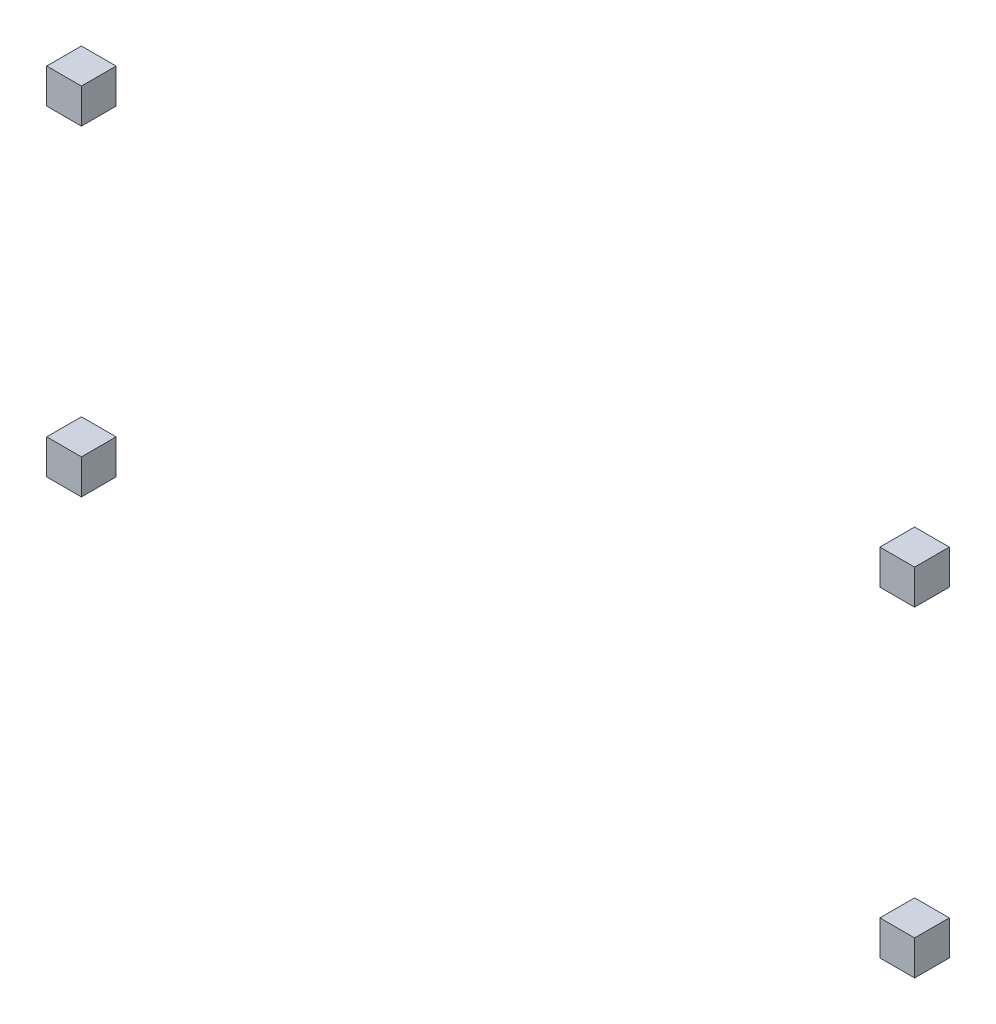
ISO-10303-21;
HEADER;
FILE_DESCRIPTION(('STEP AP214'),'2;1');
FILE_NAME('part.step','',(''),(''),'','','');
FILE_SCHEMA(('AUTOMOTIVE_DESIGN { 1 0 10303 214 1 1 1 1 }'));
ENDSEC;
DATA;
#1=APPLICATION_CONTEXT('core data for automotive mechanical design processes');
#2=APPLICATION_PROTOCOL_DEFINITION('international standard','automotive_design',2000,#1);
#3=PRODUCT_CONTEXT('',#1,'mechanical');
#4=PRODUCT('Part','Part','',(#3));
#5=PRODUCT_RELATED_PRODUCT_CATEGORY('part','',(#4));
#6=PRODUCT_DEFINITION_FORMATION('','',#4);
#7=PRODUCT_DEFINITION_CONTEXT('part definition',#1,'design');
#8=PRODUCT_DEFINITION('design','',#6,#7);
#9=PRODUCT_DEFINITION_SHAPE('','',#8);
#10=(LENGTH_UNIT() NAMED_UNIT(*) SI_UNIT(.MILLI.,.METRE.));
#11=(NAMED_UNIT(*) PLANE_ANGLE_UNIT() SI_UNIT($,.RADIAN.));
#12=(NAMED_UNIT(*) SI_UNIT($,.STERADIAN.) SOLID_ANGLE_UNIT());
#13=UNCERTAINTY_MEASURE_WITH_UNIT(LENGTH_MEASURE(1.E-05),#10,'distance_accuracy_value','');
#14=(GEOMETRIC_REPRESENTATION_CONTEXT(3) GLOBAL_UNCERTAINTY_ASSIGNED_CONTEXT((#13)) GLOBAL_UNIT_ASSIGNED_CONTEXT((#10,
#11,#12)) REPRESENTATION_CONTEXT('',''));
#15=CARTESIAN_POINT('',(0.,0.,0.));
#16=DIRECTION('',(0.,0.,1.));
#17=DIRECTION('',(1.,0.,0.));
#18=AXIS2_PLACEMENT_3D('',#15,#16,#17);
#19=CARTESIAN_POINT('',(-500.,165.,-45.));
#20=DIRECTION('',(0.,0.,1.));
#21=DIRECTION('',(1.,0.,0.));
#22=AXIS2_PLACEMENT_3D('',#19,#20,#21);
#23=PLANE('',#22);
#24=DIRECTION('',(0.,1.,0.));
#25=VECTOR('',#24,1.);
#26=CARTESIAN_POINT('',(-500.,165.,-45.));
#27=LINE('',#26,#25);
#28=CARTESIAN_POINT('',(-500.,165.,-45.));
#29=VERTEX_POINT('',#28);
#30=CARTESIAN_POINT('',(-500.,205.,-45.));
#31=VERTEX_POINT('',#30);
#32=EDGE_CURVE('P0_E99',#29,#31,#27,.T.);
#33=ORIENTED_EDGE('',*,*,#32,.F.);
#34=DIRECTION('',(1.,0.,0.));
#35=VECTOR('',#34,1.);
#36=CARTESIAN_POINT('',(-500.,165.,-45.));
#37=LINE('',#36,#35);
#38=CARTESIAN_POINT('',(-460.,165.,-45.));
#39=VERTEX_POINT('',#38);
#40=EDGE_CURVE('P0_E77',#29,#39,#37,.T.);
#41=ORIENTED_EDGE('',*,*,#40,.T.);
#42=DIRECTION('',(0.,1.,0.));
#43=VECTOR('',#42,1.);
#44=CARTESIAN_POINT('',(-460.,165.,-45.));
#45=LINE('',#44,#43);
#46=CARTESIAN_POINT('',(-460.,205.,-45.));
#47=VERTEX_POINT('',#46);
#48=EDGE_CURVE('P0_E90',#39,#47,#45,.T.);
#49=ORIENTED_EDGE('',*,*,#48,.T.);
#50=DIRECTION('',(1.,0.,0.));
#51=VECTOR('',#50,1.);
#52=CARTESIAN_POINT('',(-500.,205.,-45.));
#53=LINE('',#52,#51);
#54=EDGE_CURVE('P0_E11',#31,#47,#53,.T.);
#55=ORIENTED_EDGE('',*,*,#54,.F.);
#56=EDGE_LOOP('',(#33,#41,#49,#55));
#57=FACE_BOUND('',#56,.T.);
#58=ADVANCED_FACE('P0_F17',(#57),#23,.T.);
#59=CARTESIAN_POINT('',(-500.,165.,-85.));
#60=DIRECTION('',(0.,0.,1.));
#61=DIRECTION('',(1.,0.,0.));
#62=AXIS2_PLACEMENT_3D('',#59,#60,#61);
#63=PLANE('',#62);
#64=DIRECTION('',(1.,0.,0.));
#65=VECTOR('',#64,1.);
#66=CARTESIAN_POINT('',(-500.,205.,-85.));
#67=LINE('',#66,#65);
#68=CARTESIAN_POINT('',(-500.,205.,-85.));
#69=VERTEX_POINT('',#68);
#70=CARTESIAN_POINT('',(-460.,205.,-85.));
#71=VERTEX_POINT('',#70);
#72=EDGE_CURVE('P0_E27',#69,#71,#67,.T.);
#73=ORIENTED_EDGE('',*,*,#72,.T.);
#74=DIRECTION('',(0.,1.,0.));
#75=VECTOR('',#74,1.);
#76=CARTESIAN_POINT('',(-460.,165.,-85.));
#77=LINE('',#76,#75);
#78=CARTESIAN_POINT('',(-460.,165.,-85.));
#79=VERTEX_POINT('',#78);
#80=EDGE_CURVE('P0_E81',#79,#71,#77,.T.);
#81=ORIENTED_EDGE('',*,*,#80,.F.);
#82=DIRECTION('',(1.,0.,0.));
#83=VECTOR('',#82,1.);
#84=CARTESIAN_POINT('',(-500.,165.,-85.));
#85=LINE('',#84,#83);
#86=CARTESIAN_POINT('',(-500.,165.,-85.));
#87=VERTEX_POINT('',#86);
#88=EDGE_CURVE('P0_E67',#87,#79,#85,.T.);
#89=ORIENTED_EDGE('',*,*,#88,.F.);
#90=DIRECTION('',(0.,1.,0.));
#91=VECTOR('',#90,1.);
#92=CARTESIAN_POINT('',(-500.,165.,-85.));
#93=LINE('',#92,#91);
#94=EDGE_CURVE('P0_E96',#87,#69,#93,.T.);
#95=ORIENTED_EDGE('',*,*,#94,.T.);
#96=EDGE_LOOP('',(#73,#81,#89,#95));
#97=FACE_BOUND('',#96,.T.);
#98=ADVANCED_FACE('P0_F19',(#97),#63,.F.);
#99=CARTESIAN_POINT('',(-500.,205.,-85.));
#100=DIRECTION('',(0.,1.,0.));
#101=DIRECTION('',(1.,0.,0.));
#102=AXIS2_PLACEMENT_3D('',#99,#100,#101);
#103=PLANE('',#102);
#104=ORIENTED_EDGE('',*,*,#72,.F.);
#105=DIRECTION('',(0.,0.,1.));
#106=VECTOR('',#105,1.);
#107=CARTESIAN_POINT('',(-500.,205.,-85.));
#108=LINE('',#107,#106);
#109=EDGE_CURVE('P0_E103',#69,#31,#108,.T.);
#110=ORIENTED_EDGE('',*,*,#109,.T.);
#111=ORIENTED_EDGE('',*,*,#54,.T.);
#112=DIRECTION('',(0.,0.,1.));
#113=VECTOR('',#112,1.);
#114=CARTESIAN_POINT('',(-460.,205.,-85.));
#115=LINE('',#114,#113);
#116=EDGE_CURVE('P0_E84',#71,#47,#115,.T.);
#117=ORIENTED_EDGE('',*,*,#116,.F.);
#118=EDGE_LOOP('',(#104,#110,#111,#117));
#119=FACE_BOUND('',#118,.T.);
#120=ADVANCED_FACE('P0_F146',(#119),#103,.T.);
#121=CARTESIAN_POINT('',(-500.,165.,-85.));
#122=DIRECTION('',(0.,1.,0.));
#123=DIRECTION('',(1.,0.,0.));
#124=AXIS2_PLACEMENT_3D('',#121,#122,#123);
#125=PLANE('',#124);
#126=DIRECTION('',(0.,0.,1.));
#127=VECTOR('',#126,1.);
#128=CARTESIAN_POINT('',(-460.,165.,-85.));
#129=LINE('',#128,#127);
#130=EDGE_CURVE('P0_E73',#79,#39,#129,.T.);
#131=ORIENTED_EDGE('',*,*,#130,.T.);
#132=ORIENTED_EDGE('',*,*,#40,.F.);
#133=DIRECTION('',(0.,0.,1.));
#134=VECTOR('',#133,1.);
#135=CARTESIAN_POINT('',(-500.,165.,-85.));
#136=LINE('',#135,#134);
#137=EDGE_CURVE('P0_E74',#87,#29,#136,.T.);
#138=ORIENTED_EDGE('',*,*,#137,.F.);
#139=ORIENTED_EDGE('',*,*,#88,.T.);
#140=EDGE_LOOP('',(#131,#132,#138,#139));
#141=FACE_BOUND('',#140,.T.);
#142=ADVANCED_FACE('P0_F69',(#141),#125,.F.);
#143=CARTESIAN_POINT('',(-460.,165.,-85.));
#144=DIRECTION('',(1.,0.,0.));
#145=DIRECTION('',(0.,1.,0.));
#146=AXIS2_PLACEMENT_3D('',#143,#144,#145);
#147=PLANE('',#146);
#148=ORIENTED_EDGE('',*,*,#130,.F.);
#149=ORIENTED_EDGE('',*,*,#80,.T.);
#150=ORIENTED_EDGE('',*,*,#116,.T.);
#151=ORIENTED_EDGE('',*,*,#48,.F.);
#152=EDGE_LOOP('',(#148,#149,#150,#151));
#153=FACE_BOUND('',#152,.T.);
#154=ADVANCED_FACE('P0_F86',(#153),#147,.T.);
#155=CARTESIAN_POINT('',(-500.,165.,-85.));
#156=DIRECTION('',(1.,0.,0.));
#157=DIRECTION('',(0.,1.,0.));
#158=AXIS2_PLACEMENT_3D('',#155,#156,#157);
#159=PLANE('',#158);
#160=ORIENTED_EDGE('',*,*,#32,.T.);
#161=ORIENTED_EDGE('',*,*,#109,.F.);
#162=ORIENTED_EDGE('',*,*,#94,.F.);
#163=ORIENTED_EDGE('',*,*,#137,.T.);
#164=EDGE_LOOP('',(#160,#161,#162,#163));
#165=FACE_BOUND('',#164,.T.);
#166=ADVANCED_FACE('P0_F128',(#165),#159,.F.);
#167=CLOSED_SHELL('',(#58,#98,#120,#142,#154,#166));
#168=MANIFOLD_SOLID_BREP('P0_B1',#167);
#169=CARTESIAN_POINT('',(460.,-205.,-45.));
#170=DIRECTION('',(0.,0.,1.));
#171=DIRECTION('',(1.,0.,0.));
#172=AXIS2_PLACEMENT_3D('',#169,#170,#171);
#173=PLANE('',#172);
#174=DIRECTION('',(0.,1.,0.));
#175=VECTOR('',#174,1.);
#176=CARTESIAN_POINT('',(460.,-205.,-45.));
#177=LINE('',#176,#175);
#178=CARTESIAN_POINT('',(460.,-205.,-45.));
#179=VERTEX_POINT('',#178);
#180=CARTESIAN_POINT('',(460.,-165.,-45.));
#181=VERTEX_POINT('',#180);
#182=EDGE_CURVE('P1_E163',#179,#181,#177,.T.);
#183=ORIENTED_EDGE('',*,*,#182,.F.);
#184=DIRECTION('',(1.,0.,0.));
#185=VECTOR('',#184,1.);
#186=CARTESIAN_POINT('',(460.,-205.,-45.));
#187=LINE('',#186,#185);
#188=CARTESIAN_POINT('',(500.,-205.,-45.));
#189=VERTEX_POINT('',#188);
#190=EDGE_CURVE('P1_E77',#179,#189,#187,.T.);
#191=ORIENTED_EDGE('',*,*,#190,.T.);
#192=DIRECTION('',(0.,1.,0.));
#193=VECTOR('',#192,1.);
#194=CARTESIAN_POINT('',(500.,-205.,-45.));
#195=LINE('',#194,#193);
#196=CARTESIAN_POINT('',(500.,-165.,-45.));
#197=VERTEX_POINT('',#196);
#198=EDGE_CURVE('P1_E89',#189,#197,#195,.T.);
#199=ORIENTED_EDGE('',*,*,#198,.T.);
#200=DIRECTION('',(1.,0.,0.));
#201=VECTOR('',#200,1.);
#202=CARTESIAN_POINT('',(460.,-165.,-45.));
#203=LINE('',#202,#201);
#204=EDGE_CURVE('P1_E11',#181,#197,#203,.T.);
#205=ORIENTED_EDGE('',*,*,#204,.F.);
#206=EDGE_LOOP('',(#183,#191,#199,#205));
#207=FACE_BOUND('',#206,.T.);
#208=ADVANCED_FACE('P1_F17',(#207),#173,.T.);
#209=CARTESIAN_POINT('',(460.,-205.,-85.));
#210=DIRECTION('',(0.,0.,1.));
#211=DIRECTION('',(1.,0.,0.));
#212=AXIS2_PLACEMENT_3D('',#209,#210,#211);
#213=PLANE('',#212);
#214=DIRECTION('',(1.,0.,0.));
#215=VECTOR('',#214,1.);
#216=CARTESIAN_POINT('',(460.,-165.,-85.));
#217=LINE('',#216,#215);
#218=CARTESIAN_POINT('',(460.,-165.,-85.));
#219=VERTEX_POINT('',#218);
#220=CARTESIAN_POINT('',(500.,-165.,-85.));
#221=VERTEX_POINT('',#220);
#222=EDGE_CURVE('P1_E25',#219,#221,#217,.T.);
#223=ORIENTED_EDGE('',*,*,#222,.T.);
#224=DIRECTION('',(0.,1.,0.));
#225=VECTOR('',#224,1.);
#226=CARTESIAN_POINT('',(500.,-205.,-85.));
#227=LINE('',#226,#225);
#228=CARTESIAN_POINT('',(500.,-205.,-85.));
#229=VERTEX_POINT('',#228);
#230=EDGE_CURVE('P1_E81',#229,#221,#227,.T.);
#231=ORIENTED_EDGE('',*,*,#230,.F.);
#232=DIRECTION('',(1.,0.,0.));
#233=VECTOR('',#232,1.);
#234=CARTESIAN_POINT('',(460.,-205.,-85.));
#235=LINE('',#234,#233);
#236=CARTESIAN_POINT('',(460.,-205.,-85.));
#237=VERTEX_POINT('',#236);
#238=EDGE_CURVE('P1_E69',#237,#229,#235,.T.);
#239=ORIENTED_EDGE('',*,*,#238,.F.);
#240=DIRECTION('',(0.,1.,0.));
#241=VECTOR('',#240,1.);
#242=CARTESIAN_POINT('',(460.,-205.,-85.));
#243=LINE('',#242,#241);
#244=EDGE_CURVE('P1_E96',#237,#219,#243,.T.);
#245=ORIENTED_EDGE('',*,*,#244,.T.);
#246=EDGE_LOOP('',(#223,#231,#239,#245));
#247=FACE_BOUND('',#246,.T.);
#248=ADVANCED_FACE('P1_F85',(#247),#213,.F.);
#249=CARTESIAN_POINT('',(460.,-165.,-85.));
#250=DIRECTION('',(0.,1.,0.));
#251=DIRECTION('',(1.,0.,0.));
#252=AXIS2_PLACEMENT_3D('',#249,#250,#251);
#253=PLANE('',#252);
#254=ORIENTED_EDGE('',*,*,#222,.F.);
#255=DIRECTION('',(0.,0.,1.));
#256=VECTOR('',#255,1.);
#257=CARTESIAN_POINT('',(460.,-165.,-85.));
#258=LINE('',#257,#256);
#259=EDGE_CURVE('P1_E170',#219,#181,#258,.T.);
#260=ORIENTED_EDGE('',*,*,#259,.T.);
#261=ORIENTED_EDGE('',*,*,#204,.T.);
#262=DIRECTION('',(0.,0.,1.));
#263=VECTOR('',#262,1.);
#264=CARTESIAN_POINT('',(500.,-165.,-85.));
#265=LINE('',#264,#263);
#266=EDGE_CURVE('P1_E88',#221,#197,#265,.T.);
#267=ORIENTED_EDGE('',*,*,#266,.F.);
#268=EDGE_LOOP('',(#254,#260,#261,#267));
#269=FACE_BOUND('',#268,.T.);
#270=ADVANCED_FACE('P1_F127',(#269),#253,.T.);
#271=CARTESIAN_POINT('',(460.,-205.,-85.));
#272=DIRECTION('',(0.,1.,0.));
#273=DIRECTION('',(1.,0.,0.));
#274=AXIS2_PLACEMENT_3D('',#271,#272,#273);
#275=PLANE('',#274);
#276=DIRECTION('',(0.,0.,1.));
#277=VECTOR('',#276,1.);
#278=CARTESIAN_POINT('',(500.,-205.,-85.));
#279=LINE('',#278,#277);
#280=EDGE_CURVE('P1_E73',#229,#189,#279,.T.);
#281=ORIENTED_EDGE('',*,*,#280,.T.);
#282=ORIENTED_EDGE('',*,*,#190,.F.);
#283=DIRECTION('',(0.,0.,1.));
#284=VECTOR('',#283,1.);
#285=CARTESIAN_POINT('',(460.,-205.,-85.));
#286=LINE('',#285,#284);
#287=EDGE_CURVE('P1_E74',#237,#179,#286,.T.);
#288=ORIENTED_EDGE('',*,*,#287,.F.);
#289=ORIENTED_EDGE('',*,*,#238,.T.);
#290=EDGE_LOOP('',(#281,#282,#288,#289));
#291=FACE_BOUND('',#290,.T.);
#292=ADVANCED_FACE('P1_F75',(#291),#275,.F.);
#293=CARTESIAN_POINT('',(500.,-205.,-85.));
#294=DIRECTION('',(1.,0.,0.));
#295=DIRECTION('',(0.,1.,0.));
#296=AXIS2_PLACEMENT_3D('',#293,#294,#295);
#297=PLANE('',#296);
#298=ORIENTED_EDGE('',*,*,#280,.F.);
#299=ORIENTED_EDGE('',*,*,#230,.T.);
#300=ORIENTED_EDGE('',*,*,#266,.T.);
#301=ORIENTED_EDGE('',*,*,#198,.F.);
#302=EDGE_LOOP('',(#298,#299,#300,#301));
#303=FACE_BOUND('',#302,.T.);
#304=ADVANCED_FACE('P1_F90',(#303),#297,.T.);
#305=CARTESIAN_POINT('',(460.,-205.,-85.));
#306=DIRECTION('',(1.,0.,0.));
#307=DIRECTION('',(0.,1.,0.));
#308=AXIS2_PLACEMENT_3D('',#305,#306,#307);
#309=PLANE('',#308);
#310=ORIENTED_EDGE('',*,*,#182,.T.);
#311=ORIENTED_EDGE('',*,*,#259,.F.);
#312=ORIENTED_EDGE('',*,*,#244,.F.);
#313=ORIENTED_EDGE('',*,*,#287,.T.);
#314=EDGE_LOOP('',(#310,#311,#312,#313));
#315=FACE_BOUND('',#314,.T.);
#316=ADVANCED_FACE('P1_F107',(#315),#309,.F.);
#317=CLOSED_SHELL('',(#208,#248,#270,#292,#304,#316));
#318=MANIFOLD_SOLID_BREP('P1_B1',#317);
#319=CARTESIAN_POINT('',(-500.,-205.,-45.));
#320=DIRECTION('',(0.,0.,1.));
#321=DIRECTION('',(1.,0.,0.));
#322=AXIS2_PLACEMENT_3D('',#319,#320,#321);
#323=PLANE('',#322);
#324=DIRECTION('',(0.,1.,0.));
#325=VECTOR('',#324,1.);
#326=CARTESIAN_POINT('',(-500.,-205.,-45.));
#327=LINE('',#326,#325);
#328=CARTESIAN_POINT('',(-500.,-205.,-45.));
#329=VERTEX_POINT('',#328);
#330=CARTESIAN_POINT('',(-500.,-165.,-45.));
#331=VERTEX_POINT('',#330);
#332=EDGE_CURVE('P2_E86',#329,#331,#327,.T.);
#333=ORIENTED_EDGE('',*,*,#332,.F.);
#334=DIRECTION('',(1.,0.,0.));
#335=VECTOR('',#334,1.);
#336=CARTESIAN_POINT('',(-500.,-205.,-45.));
#337=LINE('',#336,#335);
#338=CARTESIAN_POINT('',(-460.,-205.,-45.));
#339=VERTEX_POINT('',#338);
#340=EDGE_CURVE('P2_E69',#329,#339,#337,.T.);
#341=ORIENTED_EDGE('',*,*,#340,.T.);
#342=DIRECTION('',(0.,1.,0.));
#343=VECTOR('',#342,1.);
#344=CARTESIAN_POINT('',(-460.,-205.,-45.));
#345=LINE('',#344,#343);
#346=CARTESIAN_POINT('',(-460.,-165.,-45.));
#347=VERTEX_POINT('',#346);
#348=EDGE_CURVE('P2_E85',#339,#347,#345,.T.);
#349=ORIENTED_EDGE('',*,*,#348,.T.);
#350=DIRECTION('',(1.,0.,0.));
#351=VECTOR('',#350,1.);
#352=CARTESIAN_POINT('',(-500.,-165.,-45.));
#353=LINE('',#352,#351);
#354=EDGE_CURVE('P2_E11',#331,#347,#353,.T.);
#355=ORIENTED_EDGE('',*,*,#354,.F.);
#356=EDGE_LOOP('',(#333,#341,#349,#355));
#357=FACE_BOUND('',#356,.T.);
#358=ADVANCED_FACE('P2_F17',(#357),#323,.T.);
#359=CARTESIAN_POINT('',(-500.,-205.,-85.));
#360=DIRECTION('',(0.,0.,1.));
#361=DIRECTION('',(1.,0.,0.));
#362=AXIS2_PLACEMENT_3D('',#359,#360,#361);
#363=PLANE('',#362);
#364=DIRECTION('',(1.,0.,0.));
#365=VECTOR('',#364,1.);
#366=CARTESIAN_POINT('',(-500.,-165.,-85.));
#367=LINE('',#366,#365);
#368=CARTESIAN_POINT('',(-500.,-165.,-85.));
#369=VERTEX_POINT('',#368);
#370=CARTESIAN_POINT('',(-460.,-165.,-85.));
#371=VERTEX_POINT('',#370);
#372=EDGE_CURVE('P2_E20',#369,#371,#367,.T.);
#373=ORIENTED_EDGE('',*,*,#372,.T.);
#374=DIRECTION('',(0.,1.,0.));
#375=VECTOR('',#374,1.);
#376=CARTESIAN_POINT('',(-460.,-205.,-85.));
#377=LINE('',#376,#375);
#378=CARTESIAN_POINT('',(-460.,-205.,-85.));
#379=VERTEX_POINT('',#378);
#380=EDGE_CURVE('P2_E99',#379,#371,#377,.T.);
#381=ORIENTED_EDGE('',*,*,#380,.F.);
#382=DIRECTION('',(1.,0.,0.));
#383=VECTOR('',#382,1.);
#384=CARTESIAN_POINT('',(-500.,-205.,-85.));
#385=LINE('',#384,#383);
#386=CARTESIAN_POINT('',(-500.,-205.,-85.));
#387=VERTEX_POINT('',#386);
#388=EDGE_CURVE('P2_E81',#387,#379,#385,.T.);
#389=ORIENTED_EDGE('',*,*,#388,.F.);
#390=DIRECTION('',(0.,1.,0.));
#391=VECTOR('',#390,1.);
#392=CARTESIAN_POINT('',(-500.,-205.,-85.));
#393=LINE('',#392,#391);
#394=EDGE_CURVE('P2_E90',#387,#369,#393,.T.);
#395=ORIENTED_EDGE('',*,*,#394,.T.);
#396=EDGE_LOOP('',(#373,#381,#389,#395));
#397=FACE_BOUND('',#396,.T.);
#398=ADVANCED_FACE('P2_F149',(#397),#363,.F.);
#399=CARTESIAN_POINT('',(-500.,-165.,-85.));
#400=DIRECTION('',(0.,1.,0.));
#401=DIRECTION('',(1.,0.,0.));
#402=AXIS2_PLACEMENT_3D('',#399,#400,#401);
#403=PLANE('',#402);
#404=ORIENTED_EDGE('',*,*,#372,.F.);
#405=DIRECTION('',(0.,0.,1.));
#406=VECTOR('',#405,1.);
#407=CARTESIAN_POINT('',(-500.,-165.,-85.));
#408=LINE('',#407,#406);
#409=EDGE_CURVE('P2_E91',#369,#331,#408,.T.);
#410=ORIENTED_EDGE('',*,*,#409,.T.);
#411=ORIENTED_EDGE('',*,*,#354,.T.);
#412=DIRECTION('',(0.,0.,1.));
#413=VECTOR('',#412,1.);
#414=CARTESIAN_POINT('',(-460.,-165.,-85.));
#415=LINE('',#414,#413);
#416=EDGE_CURVE('P2_E106',#371,#347,#415,.T.);
#417=ORIENTED_EDGE('',*,*,#416,.F.);
#418=EDGE_LOOP('',(#404,#410,#411,#417));
#419=FACE_BOUND('',#418,.T.);
#420=ADVANCED_FACE('P2_F143',(#419),#403,.T.);
#421=CARTESIAN_POINT('',(-500.,-205.,-85.));
#422=DIRECTION('',(0.,1.,0.));
#423=DIRECTION('',(1.,0.,0.));
#424=AXIS2_PLACEMENT_3D('',#421,#422,#423);
#425=PLANE('',#424);
#426=DIRECTION('',(0.,0.,1.));
#427=VECTOR('',#426,1.);
#428=CARTESIAN_POINT('',(-460.,-205.,-85.));
#429=LINE('',#428,#427);
#430=EDGE_CURVE('P2_E76',#379,#339,#429,.T.);
#431=ORIENTED_EDGE('',*,*,#430,.T.);
#432=ORIENTED_EDGE('',*,*,#340,.F.);
#433=DIRECTION('',(0.,0.,1.));
#434=VECTOR('',#433,1.);
#435=CARTESIAN_POINT('',(-500.,-205.,-85.));
#436=LINE('',#435,#434);
#437=EDGE_CURVE('P2_E73',#387,#329,#436,.T.);
#438=ORIENTED_EDGE('',*,*,#437,.F.);
#439=ORIENTED_EDGE('',*,*,#388,.T.);
#440=EDGE_LOOP('',(#431,#432,#438,#439));
#441=FACE_BOUND('',#440,.T.);
#442=ADVANCED_FACE('P2_F71',(#441),#425,.F.);
#443=CARTESIAN_POINT('',(-460.,-205.,-85.));
#444=DIRECTION('',(1.,0.,0.));
#445=DIRECTION('',(0.,1.,0.));
#446=AXIS2_PLACEMENT_3D('',#443,#444,#445);
#447=PLANE('',#446);
#448=ORIENTED_EDGE('',*,*,#430,.F.);
#449=ORIENTED_EDGE('',*,*,#380,.T.);
#450=ORIENTED_EDGE('',*,*,#416,.T.);
#451=ORIENTED_EDGE('',*,*,#348,.F.);
#452=EDGE_LOOP('',(#448,#449,#450,#451));
#453=FACE_BOUND('',#452,.T.);
#454=ADVANCED_FACE('P2_F122',(#453),#447,.T.);
#455=CARTESIAN_POINT('',(-500.,-205.,-85.));
#456=DIRECTION('',(1.,0.,0.));
#457=DIRECTION('',(0.,1.,0.));
#458=AXIS2_PLACEMENT_3D('',#455,#456,#457);
#459=PLANE('',#458);
#460=ORIENTED_EDGE('',*,*,#332,.T.);
#461=ORIENTED_EDGE('',*,*,#409,.F.);
#462=ORIENTED_EDGE('',*,*,#394,.F.);
#463=ORIENTED_EDGE('',*,*,#437,.T.);
#464=EDGE_LOOP('',(#460,#461,#462,#463));
#465=FACE_BOUND('',#464,.T.);
#466=ADVANCED_FACE('P2_F88',(#465),#459,.F.);
#467=CLOSED_SHELL('',(#358,#398,#420,#442,#454,#466));
#468=MANIFOLD_SOLID_BREP('P2_B1',#467);
#469=CARTESIAN_POINT('',(460.,165.,-45.));
#470=DIRECTION('',(0.,0.,1.));
#471=DIRECTION('',(1.,0.,0.));
#472=AXIS2_PLACEMENT_3D('',#469,#470,#471);
#473=PLANE('',#472);
#474=DIRECTION('',(0.,1.,0.));
#475=VECTOR('',#474,1.);
#476=CARTESIAN_POINT('',(460.,165.,-45.));
#477=LINE('',#476,#475);
#478=CARTESIAN_POINT('',(460.,165.,-45.));
#479=VERTEX_POINT('',#478);
#480=CARTESIAN_POINT('',(460.,205.,-45.));
#481=VERTEX_POINT('',#480);
#482=EDGE_CURVE('P3_E169',#479,#481,#477,.T.);
#483=ORIENTED_EDGE('',*,*,#482,.F.);
#484=DIRECTION('',(1.,0.,0.));
#485=VECTOR('',#484,1.);
#486=CARTESIAN_POINT('',(460.,165.,-45.));
#487=LINE('',#486,#485);
#488=CARTESIAN_POINT('',(500.,165.,-45.));
#489=VERTEX_POINT('',#488);
#490=EDGE_CURVE('P3_E80',#479,#489,#487,.T.);
#491=ORIENTED_EDGE('',*,*,#490,.T.);
#492=DIRECTION('',(0.,1.,0.));
#493=VECTOR('',#492,1.);
#494=CARTESIAN_POINT('',(500.,165.,-45.));
#495=LINE('',#494,#493);
#496=CARTESIAN_POINT('',(500.,205.,-45.));
#497=VERTEX_POINT('',#496);
#498=EDGE_CURVE('P3_E90',#489,#497,#495,.T.);
#499=ORIENTED_EDGE('',*,*,#498,.T.);
#500=DIRECTION('',(1.,0.,0.));
#501=VECTOR('',#500,1.);
#502=CARTESIAN_POINT('',(460.,205.,-45.));
#503=LINE('',#502,#501);
#504=EDGE_CURVE('P3_E10',#481,#497,#503,.T.);
#505=ORIENTED_EDGE('',*,*,#504,.F.);
#506=EDGE_LOOP('',(#483,#491,#499,#505));
#507=FACE_BOUND('',#506,.T.);
#508=ADVANCED_FACE('P3_F16',(#507),#473,.T.);
#509=CARTESIAN_POINT('',(460.,165.,-85.));
#510=DIRECTION('',(0.,0.,1.));
#511=DIRECTION('',(1.,0.,0.));
#512=AXIS2_PLACEMENT_3D('',#509,#510,#511);
#513=PLANE('',#512);
#514=DIRECTION('',(1.,0.,0.));
#515=VECTOR('',#514,1.);
#516=CARTESIAN_POINT('',(460.,205.,-85.));
#517=LINE('',#516,#515);
#518=CARTESIAN_POINT('',(460.,205.,-85.));
#519=VERTEX_POINT('',#518);
#520=CARTESIAN_POINT('',(500.,205.,-85.));
#521=VERTEX_POINT('',#520);
#522=EDGE_CURVE('P3_E24',#519,#521,#517,.T.);
#523=ORIENTED_EDGE('',*,*,#522,.T.);
#524=DIRECTION('',(0.,1.,0.));
#525=VECTOR('',#524,1.);
#526=CARTESIAN_POINT('',(500.,165.,-85.));
#527=LINE('',#526,#525);
#528=CARTESIAN_POINT('',(500.,165.,-85.));
#529=VERTEX_POINT('',#528);
#530=EDGE_CURVE('P3_E79',#529,#521,#527,.T.);
#531=ORIENTED_EDGE('',*,*,#530,.F.);
#532=DIRECTION('',(1.,0.,0.));
#533=VECTOR('',#532,1.);
#534=CARTESIAN_POINT('',(460.,165.,-85.));
#535=LINE('',#534,#533);
#536=CARTESIAN_POINT('',(460.,165.,-85.));
#537=VERTEX_POINT('',#536);
#538=EDGE_CURVE('P3_E67',#537,#529,#535,.T.);
#539=ORIENTED_EDGE('',*,*,#538,.F.);
#540=DIRECTION('',(0.,1.,0.));
#541=VECTOR('',#540,1.);
#542=CARTESIAN_POINT('',(460.,165.,-85.));
#543=LINE('',#542,#541);
#544=EDGE_CURVE('P3_E96',#537,#519,#543,.T.);
#545=ORIENTED_EDGE('',*,*,#544,.T.);
#546=EDGE_LOOP('',(#523,#531,#539,#545));
#547=FACE_BOUND('',#546,.T.);
#548=ADVANCED_FACE('P3_F81',(#547),#513,.F.);
#549=CARTESIAN_POINT('',(460.,205.,-85.));
#550=DIRECTION('',(0.,1.,0.));
#551=DIRECTION('',(1.,0.,0.));
#552=AXIS2_PLACEMENT_3D('',#549,#550,#551);
#553=PLANE('',#552);
#554=ORIENTED_EDGE('',*,*,#522,.F.);
#555=DIRECTION('',(0.,0.,1.));
#556=VECTOR('',#555,1.);
#557=CARTESIAN_POINT('',(460.,205.,-85.));
#558=LINE('',#557,#556);
#559=EDGE_CURVE('P3_E171',#519,#481,#558,.T.);
#560=ORIENTED_EDGE('',*,*,#559,.T.);
#561=ORIENTED_EDGE('',*,*,#504,.T.);
#562=DIRECTION('',(0.,0.,1.));
#563=VECTOR('',#562,1.);
#564=CARTESIAN_POINT('',(500.,205.,-85.));
#565=LINE('',#564,#563);
#566=EDGE_CURVE('P3_E84',#521,#497,#565,.T.);
#567=ORIENTED_EDGE('',*,*,#566,.F.);
#568=EDGE_LOOP('',(#554,#560,#561,#567));
#569=FACE_BOUND('',#568,.T.);
#570=ADVANCED_FACE('P3_F132',(#569),#553,.T.);
#571=CARTESIAN_POINT('',(460.,165.,-85.));
#572=DIRECTION('',(0.,1.,0.));
#573=DIRECTION('',(1.,0.,0.));
#574=AXIS2_PLACEMENT_3D('',#571,#572,#573);
#575=PLANE('',#574);
#576=DIRECTION('',(0.,0.,1.));
#577=VECTOR('',#576,1.);
#578=CARTESIAN_POINT('',(500.,165.,-85.));
#579=LINE('',#578,#577);
#580=EDGE_CURVE('P3_E71',#529,#489,#579,.T.);
#581=ORIENTED_EDGE('',*,*,#580,.T.);
#582=ORIENTED_EDGE('',*,*,#490,.F.);
#583=DIRECTION('',(0.,0.,1.));
#584=VECTOR('',#583,1.);
#585=CARTESIAN_POINT('',(460.,165.,-85.));
#586=LINE('',#585,#584);
#587=EDGE_CURVE('P3_E72',#537,#479,#586,.T.);
#588=ORIENTED_EDGE('',*,*,#587,.F.);
#589=ORIENTED_EDGE('',*,*,#538,.T.);
#590=EDGE_LOOP('',(#581,#582,#588,#589));
#591=FACE_BOUND('',#590,.T.);
#592=ADVANCED_FACE('P3_F69',(#591),#575,.F.);
#593=CARTESIAN_POINT('',(500.,165.,-85.));
#594=DIRECTION('',(1.,0.,0.));
#595=DIRECTION('',(0.,1.,0.));
#596=AXIS2_PLACEMENT_3D('',#593,#594,#595);
#597=PLANE('',#596);
#598=ORIENTED_EDGE('',*,*,#580,.F.);
#599=ORIENTED_EDGE('',*,*,#530,.T.);
#600=ORIENTED_EDGE('',*,*,#566,.T.);
#601=ORIENTED_EDGE('',*,*,#498,.F.);
#602=EDGE_LOOP('',(#598,#599,#600,#601));
#603=FACE_BOUND('',#602,.T.);
#604=ADVANCED_FACE('P3_F86',(#603),#597,.T.);
#605=CARTESIAN_POINT('',(460.,165.,-85.));
#606=DIRECTION('',(1.,0.,0.));
#607=DIRECTION('',(0.,1.,0.));
#608=AXIS2_PLACEMENT_3D('',#605,#606,#607);
#609=PLANE('',#608);
#610=ORIENTED_EDGE('',*,*,#482,.T.);
#611=ORIENTED_EDGE('',*,*,#559,.F.);
#612=ORIENTED_EDGE('',*,*,#544,.F.);
#613=ORIENTED_EDGE('',*,*,#587,.T.);
#614=EDGE_LOOP('',(#610,#611,#612,#613));
#615=FACE_BOUND('',#614,.T.);
#616=ADVANCED_FACE('P3_F115',(#615),#609,.F.);
#617=CLOSED_SHELL('',(#508,#548,#570,#592,#604,#616));
#618=MANIFOLD_SOLID_BREP('P3_B1',#617);
#619=ADVANCED_BREP_SHAPE_REPRESENTATION('',(#18,#168,#318,#468,#618),#14);
#620=SHAPE_DEFINITION_REPRESENTATION(#9,#619);
ENDSEC;
END-ISO-10303-21;
